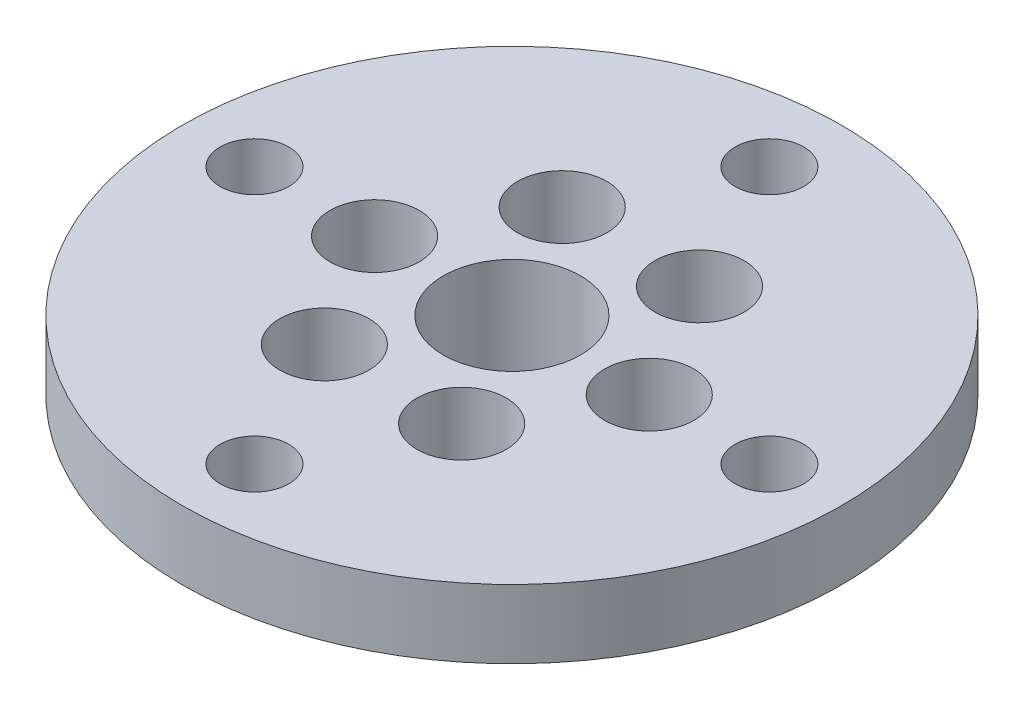
ISO-10303-21;
HEADER;
FILE_DESCRIPTION(('STEP AP214'),'2;1');
FILE_NAME('part.step','',(''),(''),'','','');
FILE_SCHEMA(('AUTOMOTIVE_DESIGN { 1 0 10303 214 1 1 1 1 }'));
ENDSEC;
DATA;
#1=APPLICATION_CONTEXT('core data for automotive mechanical design processes');
#2=APPLICATION_PROTOCOL_DEFINITION('international standard','automotive_design',2000,#1);
#3=PRODUCT_CONTEXT('',#1,'mechanical');
#4=PRODUCT('Part','Part','',(#3));
#5=PRODUCT_RELATED_PRODUCT_CATEGORY('part','',(#4));
#6=PRODUCT_DEFINITION_FORMATION('','',#4);
#7=PRODUCT_DEFINITION_CONTEXT('part definition',#1,'design');
#8=PRODUCT_DEFINITION('design','',#6,#7);
#9=PRODUCT_DEFINITION_SHAPE('','',#8);
#10=(LENGTH_UNIT() NAMED_UNIT(*) SI_UNIT(.MILLI.,.METRE.));
#11=(NAMED_UNIT(*) PLANE_ANGLE_UNIT() SI_UNIT($,.RADIAN.));
#12=(NAMED_UNIT(*) SI_UNIT($,.STERADIAN.) SOLID_ANGLE_UNIT());
#13=UNCERTAINTY_MEASURE_WITH_UNIT(LENGTH_MEASURE(1.E-05),#10,'distance_accuracy_value','');
#14=(GEOMETRIC_REPRESENTATION_CONTEXT(3) GLOBAL_UNCERTAINTY_ASSIGNED_CONTEXT((#13)) GLOBAL_UNIT_ASSIGNED_CONTEXT((#10,
#11,#12)) REPRESENTATION_CONTEXT('',''));
#15=CARTESIAN_POINT('',(0.,0.,0.));
#16=DIRECTION('',(0.,0.,1.));
#17=DIRECTION('',(1.,0.,0.));
#18=AXIS2_PLACEMENT_3D('',#15,#16,#17);
#19=CARTESIAN_POINT('',(-4.99999999999981,11.5,-8.66025403784503));
#20=DIRECTION('',(0.,-1.,0.));
#21=DIRECTION('',(0.,0.,-1.));
#22=AXIS2_PLACEMENT_3D('',#19,#20,#21);
#23=CYLINDRICAL_SURFACE('',#22,1.24999999999972);
#24=CARTESIAN_POINT('',(-4.99999999999981,0.,-8.66025403784503));
#25=DIRECTION('',(0.,1.,0.));
#26=DIRECTION('',(0.,0.,1.));
#27=AXIS2_PLACEMENT_3D('',#24,#25,#26);
#28=CIRCLE('',#27,1.24999999999972);
#29=CARTESIAN_POINT('',(-4.99999999999981,0.,-7.41025403784531));
#30=VERTEX_POINT('',#29);
#31=EDGE_CURVE('E65',#30,#30,#28,.T.);
#32=ORIENTED_EDGE('',*,*,#31,.F.);
#33=EDGE_LOOP('',(#32));
#34=FACE_BOUND('',#33,.T.);
#35=CARTESIAN_POINT('',(-4.99999999999981,4.,-8.66025403784503));
#36=DIRECTION('',(0.,1.,0.));
#37=DIRECTION('',(0.,0.,1.));
#38=AXIS2_PLACEMENT_3D('',#35,#36,#37);
#39=CIRCLE('',#38,1.24999999999972);
#40=CARTESIAN_POINT('',(-4.99999999999981,4.,-7.41025403784531));
#41=VERTEX_POINT('',#40);
#42=EDGE_CURVE('E82',#41,#41,#39,.T.);
#43=ORIENTED_EDGE('',*,*,#42,.T.);
#44=EDGE_LOOP('',(#43));
#45=FACE_BOUND('',#44,.T.);
#46=ADVANCED_FACE('F43',(#34,#45),#23,.F.);
#47=CARTESIAN_POINT('',(-9.99999999999999,11.5,-2.00360561475321E-13));
#48=DIRECTION('',(0.,-1.,0.));
#49=DIRECTION('',(0.,0.,-1.));
#50=AXIS2_PLACEMENT_3D('',#47,#48,#49);
#51=CYLINDRICAL_SURFACE('',#50,1.25);
#52=CARTESIAN_POINT('',(-9.99999999999999,0.,-2.00360561475321E-13));
#53=DIRECTION('',(0.,1.,0.));
#54=DIRECTION('',(0.,0.,1.));
#55=AXIS2_PLACEMENT_3D('',#52,#53,#54);
#56=CIRCLE('',#55,1.25);
#57=CARTESIAN_POINT('',(-9.99999999999999,0.,1.2499999999998));
#58=VERTEX_POINT('',#57);
#59=EDGE_CURVE('E85',#58,#58,#56,.T.);
#60=ORIENTED_EDGE('',*,*,#59,.F.);
#61=EDGE_LOOP('',(#60));
#62=FACE_BOUND('',#61,.T.);
#63=CARTESIAN_POINT('',(-9.99999999999999,4.,-2.00360561475321E-13));
#64=DIRECTION('',(0.,1.,0.));
#65=DIRECTION('',(0.,0.,1.));
#66=AXIS2_PLACEMENT_3D('',#63,#64,#65);
#67=CIRCLE('',#66,1.25);
#68=CARTESIAN_POINT('',(-9.99999999999999,4.,1.2499999999998));
#69=VERTEX_POINT('',#68);
#70=EDGE_CURVE('E79',#69,#69,#67,.T.);
#71=ORIENTED_EDGE('',*,*,#70,.T.);
#72=EDGE_LOOP('',(#71));
#73=FACE_BOUND('',#72,.T.);
#74=ADVANCED_FACE('F183',(#62,#73),#51,.F.);
#75=CARTESIAN_POINT('',(-4.99999999999968,11.5,8.66025403784456));
#76=DIRECTION('',(0.,-1.,0.));
#77=DIRECTION('',(0.,0.,-1.));
#78=AXIS2_PLACEMENT_3D('',#75,#76,#77);
#79=CYLINDRICAL_SURFACE('',#78,1.25000000000053);
#80=CARTESIAN_POINT('',(-4.99999999999968,0.,8.66025403784456));
#81=DIRECTION('',(0.,1.,0.));
#82=DIRECTION('',(0.,0.,1.));
#83=AXIS2_PLACEMENT_3D('',#80,#81,#82);
#84=CIRCLE('',#83,1.25000000000053);
#85=CARTESIAN_POINT('',(-4.99999999999968,0.,9.91025403784509));
#86=VERTEX_POINT('',#85);
#87=EDGE_CURVE('E140',#86,#86,#84,.T.);
#88=ORIENTED_EDGE('',*,*,#87,.F.);
#89=EDGE_LOOP('',(#88));
#90=FACE_BOUND('',#89,.T.);
#91=CARTESIAN_POINT('',(-4.99999999999968,4.,8.66025403784456));
#92=DIRECTION('',(0.,1.,0.));
#93=DIRECTION('',(0.,0.,1.));
#94=AXIS2_PLACEMENT_3D('',#91,#92,#93);
#95=CIRCLE('',#94,1.25000000000053);
#96=CARTESIAN_POINT('',(-4.99999999999968,4.,9.91025403784509));
#97=VERTEX_POINT('',#96);
#98=EDGE_CURVE('E76',#97,#97,#95,.T.);
#99=ORIENTED_EDGE('',*,*,#98,.T.);
#100=EDGE_LOOP('',(#99));
#101=FACE_BOUND('',#100,.T.);
#102=ADVANCED_FACE('F189',(#90,#101),#79,.F.);
#103=CARTESIAN_POINT('',(5.00000000000066,11.5,-8.6602540378451));
#104=DIRECTION('',(0.,-1.,0.));
#105=DIRECTION('',(0.,0.,-1.));
#106=AXIS2_PLACEMENT_3D('',#103,#104,#105);
#107=CYLINDRICAL_SURFACE('',#106,1.25000000000011);
#108=CARTESIAN_POINT('',(5.00000000000066,0.,-8.6602540378451));
#109=DIRECTION('',(0.,1.,0.));
#110=DIRECTION('',(0.,0.,1.));
#111=AXIS2_PLACEMENT_3D('',#108,#109,#110);
#112=CIRCLE('',#111,1.25000000000011);
#113=CARTESIAN_POINT('',(5.00000000000066,0.,-7.41025403784499));
#114=VERTEX_POINT('',#113);
#115=EDGE_CURVE('E149',#114,#114,#112,.T.);
#116=ORIENTED_EDGE('',*,*,#115,.F.);
#117=EDGE_LOOP('',(#116));
#118=FACE_BOUND('',#117,.T.);
#119=CARTESIAN_POINT('',(5.00000000000066,4.,-8.6602540378451));
#120=DIRECTION('',(0.,1.,0.));
#121=DIRECTION('',(0.,0.,1.));
#122=AXIS2_PLACEMENT_3D('',#119,#120,#121);
#123=CIRCLE('',#122,1.25000000000011);
#124=CARTESIAN_POINT('',(5.00000000000066,4.,-7.41025403784499));
#125=VERTEX_POINT('',#124);
#126=EDGE_CURVE('E73',#125,#125,#123,.T.);
#127=ORIENTED_EDGE('',*,*,#126,.T.);
#128=EDGE_LOOP('',(#127));
#129=FACE_BOUND('',#128,.T.);
#130=ADVANCED_FACE('F195',(#118,#129),#107,.F.);
#131=CARTESIAN_POINT('',(10.000000000001,11.5,-3.44968021723089E-13));
#132=DIRECTION('',(0.,-1.,0.));
#133=DIRECTION('',(0.,0.,-1.));
#134=AXIS2_PLACEMENT_3D('',#131,#132,#133);
#135=CYLINDRICAL_SURFACE('',#134,1.25000000000068);
#136=CARTESIAN_POINT('',(10.000000000001,0.,-3.44968021723089E-13));
#137=DIRECTION('',(0.,1.,0.));
#138=DIRECTION('',(0.,0.,1.));
#139=AXIS2_PLACEMENT_3D('',#136,#137,#138);
#140=CIRCLE('',#139,1.25000000000068);
#141=CARTESIAN_POINT('',(10.000000000001,0.,1.25000000000034));
#142=VERTEX_POINT('',#141);
#143=EDGE_CURVE('E146',#142,#142,#140,.T.);
#144=ORIENTED_EDGE('',*,*,#143,.F.);
#145=EDGE_LOOP('',(#144));
#146=FACE_BOUND('',#145,.T.);
#147=CARTESIAN_POINT('',(10.000000000001,4.,-3.44968021723089E-13));
#148=DIRECTION('',(0.,1.,0.));
#149=DIRECTION('',(0.,0.,1.));
#150=AXIS2_PLACEMENT_3D('',#147,#148,#149);
#151=CIRCLE('',#150,1.25000000000068);
#152=CARTESIAN_POINT('',(10.000000000001,4.,1.25000000000034));
#153=VERTEX_POINT('',#152);
#154=EDGE_CURVE('E69',#153,#153,#151,.T.);
#155=ORIENTED_EDGE('',*,*,#154,.T.);
#156=EDGE_LOOP('',(#155));
#157=FACE_BOUND('',#156,.T.);
#158=ADVANCED_FACE('F197',(#146,#157),#135,.F.);
#159=CARTESIAN_POINT('',(5.00000000000078,11.5,8.66025403784449));
#160=DIRECTION('',(0.,-1.,0.));
#161=DIRECTION('',(0.,0.,-1.));
#162=AXIS2_PLACEMENT_3D('',#159,#160,#161);
#163=CYLINDRICAL_SURFACE('',#162,1.25000000000087);
#164=CARTESIAN_POINT('',(5.00000000000078,0.,8.66025403784449));
#165=DIRECTION('',(0.,1.,0.));
#166=DIRECTION('',(0.,0.,1.));
#167=AXIS2_PLACEMENT_3D('',#164,#165,#166);
#168=CIRCLE('',#167,1.25000000000087);
#169=CARTESIAN_POINT('',(5.00000000000078,0.,9.91025403784536));
#170=VERTEX_POINT('',#169);
#171=EDGE_CURVE('E143',#170,#170,#168,.T.);
#172=ORIENTED_EDGE('',*,*,#171,.F.);
#173=EDGE_LOOP('',(#172));
#174=FACE_BOUND('',#173,.T.);
#175=CARTESIAN_POINT('',(5.00000000000078,4.,8.66025403784449));
#176=DIRECTION('',(0.,1.,0.));
#177=DIRECTION('',(0.,0.,1.));
#178=AXIS2_PLACEMENT_3D('',#175,#176,#177);
#179=CIRCLE('',#178,1.25000000000087);
#180=CARTESIAN_POINT('',(5.00000000000078,4.,9.91025403784536));
#181=VERTEX_POINT('',#180);
#182=EDGE_CURVE('E66',#181,#181,#179,.T.);
#183=ORIENTED_EDGE('',*,*,#182,.T.);
#184=EDGE_LOOP('',(#183));
#185=FACE_BOUND('',#184,.T.);
#186=ADVANCED_FACE('F200',(#174,#185),#163,.F.);
#187=CARTESIAN_POINT('',(0.,5.,0.));
#188=DIRECTION('',(0.,-1.,0.));
#189=DIRECTION('',(0.,0.,-1.));
#190=AXIS2_PLACEMENT_3D('',#187,#188,#189);
#191=CYLINDRICAL_SURFACE('',#190,15.);
#192=CARTESIAN_POINT('',(0.,5.,0.));
#193=DIRECTION('',(0.,1.,0.));
#194=DIRECTION('',(0.,0.,1.));
#195=AXIS2_PLACEMENT_3D('',#192,#193,#194);
#196=CIRCLE('',#195,15.);
#197=CARTESIAN_POINT('',(0.,5.,15.));
#198=VERTEX_POINT('',#197);
#199=EDGE_CURVE('E11',#198,#198,#196,.T.);
#200=ORIENTED_EDGE('',*,*,#199,.F.);
#201=EDGE_LOOP('',(#200));
#202=FACE_BOUND('',#201,.T.);
#203=CARTESIAN_POINT('',(0.,0.,0.));
#204=DIRECTION('',(0.,1.,0.));
#205=DIRECTION('',(0.,0.,1.));
#206=AXIS2_PLACEMENT_3D('',#203,#204,#205);
#207=CIRCLE('',#206,15.);
#208=CARTESIAN_POINT('',(0.,0.,15.));
#209=VERTEX_POINT('',#208);
#210=EDGE_CURVE('E51',#209,#209,#207,.T.);
#211=ORIENTED_EDGE('',*,*,#210,.T.);
#212=EDGE_LOOP('',(#211));
#213=FACE_BOUND('',#212,.T.);
#214=ADVANCED_FACE('F45',(#202,#213),#191,.T.);
#215=CARTESIAN_POINT('',(0.,0.,0.));
#216=DIRECTION('',(0.,1.,0.));
#217=DIRECTION('',(0.,0.,1.));
#218=AXIS2_PLACEMENT_3D('',#215,#216,#217);
#219=PLANE('',#218);
#220=ORIENTED_EDGE('',*,*,#171,.T.);
#221=EDGE_LOOP('',(#220));
#222=FACE_BOUND('',#221,.T.);
#223=ORIENTED_EDGE('',*,*,#143,.T.);
#224=EDGE_LOOP('',(#223));
#225=FACE_BOUND('',#224,.T.);
#226=ORIENTED_EDGE('',*,*,#115,.T.);
#227=EDGE_LOOP('',(#226));
#228=FACE_BOUND('',#227,.T.);
#229=CARTESIAN_POINT('',(0.,0.,0.));
#230=DIRECTION('',(0.,1.,0.));
#231=DIRECTION('',(0.,0.,1.));
#232=AXIS2_PLACEMENT_3D('',#229,#230,#231);
#233=CIRCLE('',#232,5.);
#234=CARTESIAN_POINT('',(0.,0.,5.));
#235=VERTEX_POINT('',#234);
#236=EDGE_CURVE('E152',#235,#235,#233,.T.);
#237=ORIENTED_EDGE('',*,*,#236,.T.);
#238=EDGE_LOOP('',(#237));
#239=FACE_BOUND('',#238,.T.);
#240=ORIENTED_EDGE('',*,*,#87,.T.);
#241=EDGE_LOOP('',(#240));
#242=FACE_BOUND('',#241,.T.);
#243=ORIENTED_EDGE('',*,*,#59,.T.);
#244=EDGE_LOOP('',(#243));
#245=FACE_BOUND('',#244,.T.);
#246=ORIENTED_EDGE('',*,*,#31,.T.);
#247=EDGE_LOOP('',(#246));
#248=FACE_BOUND('',#247,.T.);
#249=ORIENTED_EDGE('',*,*,#210,.F.);
#250=EDGE_LOOP('',(#249));
#251=FACE_BOUND('',#250,.T.);
#252=ADVANCED_FACE('F303',(#222,#225,#228,#239,#242,#245,#248,#251),#219,.F.);
#253=CARTESIAN_POINT('',(0.,10.,0.));
#254=DIRECTION('',(0.,-1.,0.));
#255=DIRECTION('',(0.,0.,-1.));
#256=AXIS2_PLACEMENT_3D('',#253,#254,#255);
#257=CYLINDRICAL_SURFACE('',#256,24.);
#258=CARTESIAN_POINT('',(0.,10.,0.));
#259=DIRECTION('',(0.,1.,0.));
#260=DIRECTION('',(0.,0.,1.));
#261=AXIS2_PLACEMENT_3D('',#258,#259,#260);
#262=CIRCLE('',#261,24.);
#263=CARTESIAN_POINT('',(0.,10.,24.));
#264=VERTEX_POINT('',#263);
#265=EDGE_CURVE('E56',#264,#264,#262,.T.);
#266=ORIENTED_EDGE('',*,*,#265,.F.);
#267=EDGE_LOOP('',(#266));
#268=FACE_BOUND('',#267,.T.);
#269=CARTESIAN_POINT('',(0.,5.,0.));
#270=DIRECTION('',(0.,1.,0.));
#271=DIRECTION('',(0.,0.,1.));
#272=AXIS2_PLACEMENT_3D('',#269,#270,#271);
#273=CIRCLE('',#272,24.);
#274=CARTESIAN_POINT('',(0.,5.,24.));
#275=VERTEX_POINT('',#274);
#276=EDGE_CURVE('E59',#275,#275,#273,.T.);
#277=ORIENTED_EDGE('',*,*,#276,.T.);
#278=EDGE_LOOP('',(#277));
#279=FACE_BOUND('',#278,.T.);
#280=ADVANCED_FACE('F164',(#268,#279),#257,.T.);
#281=CARTESIAN_POINT('',(0.,10.,0.));
#282=DIRECTION('',(0.,1.,0.));
#283=DIRECTION('',(0.,0.,1.));
#284=AXIS2_PLACEMENT_3D('',#281,#282,#283);
#285=PLANE('',#284);
#286=CARTESIAN_POINT('',(0.,10.,-18.75));
#287=DIRECTION('',(0.,1.,0.));
#288=DIRECTION('',(0.,0.,1.));
#289=AXIS2_PLACEMENT_3D('',#286,#287,#288);
#290=CIRCLE('',#289,2.5);
#291=CARTESIAN_POINT('',(0.,10.,-16.25));
#292=VERTEX_POINT('',#291);
#293=EDGE_CURVE('E90',#292,#292,#290,.T.);
#294=ORIENTED_EDGE('',*,*,#293,.F.);
#295=EDGE_LOOP('',(#294));
#296=FACE_BOUND('',#295,.T.);
#297=CARTESIAN_POINT('',(18.75,10.,0.));
#298=DIRECTION('',(0.,1.,0.));
#299=DIRECTION('',(0.,0.,1.));
#300=AXIS2_PLACEMENT_3D('',#297,#298,#299);
#301=CIRCLE('',#300,2.5);
#302=CARTESIAN_POINT('',(18.75,10.,2.5));
#303=VERTEX_POINT('',#302);
#304=EDGE_CURVE('E275',#303,#303,#301,.T.);
#305=ORIENTED_EDGE('',*,*,#304,.F.);
#306=EDGE_LOOP('',(#305));
#307=FACE_BOUND('',#306,.T.);
#308=CARTESIAN_POINT('',(0.,10.,18.75));
#309=DIRECTION('',(0.,1.,0.));
#310=DIRECTION('',(0.,0.,1.));
#311=AXIS2_PLACEMENT_3D('',#308,#309,#310);
#312=CIRCLE('',#311,2.5);
#313=CARTESIAN_POINT('',(0.,10.,21.25));
#314=VERTEX_POINT('',#313);
#315=EDGE_CURVE('E278',#314,#314,#312,.T.);
#316=ORIENTED_EDGE('',*,*,#315,.F.);
#317=EDGE_LOOP('',(#316));
#318=FACE_BOUND('',#317,.T.);
#319=CARTESIAN_POINT('',(-18.75,10.,0.));
#320=DIRECTION('',(0.,1.,0.));
#321=DIRECTION('',(0.,0.,1.));
#322=AXIS2_PLACEMENT_3D('',#319,#320,#321);
#323=CIRCLE('',#322,2.5);
#324=CARTESIAN_POINT('',(-18.75,10.,2.5));
#325=VERTEX_POINT('',#324);
#326=EDGE_CURVE('E109',#325,#325,#323,.T.);
#327=ORIENTED_EDGE('',*,*,#326,.F.);
#328=EDGE_LOOP('',(#327));
#329=FACE_BOUND('',#328,.T.);
#330=CARTESIAN_POINT('',(5.00000000000066,10.,-8.6602540378451));
#331=DIRECTION('',(0.,1.,0.));
#332=DIRECTION('',(0.,0.,1.));
#333=AXIS2_PLACEMENT_3D('',#330,#331,#332);
#334=CIRCLE('',#333,3.25000000000011);
#335=CARTESIAN_POINT('',(5.00000000000066,10.,-5.41025403784499));
#336=VERTEX_POINT('',#335);
#337=EDGE_CURVE('E115',#336,#336,#334,.T.);
#338=ORIENTED_EDGE('',*,*,#337,.F.);
#339=EDGE_LOOP('',(#338));
#340=FACE_BOUND('',#339,.T.);
#341=CARTESIAN_POINT('',(5.00000000000025,10.,8.66025403784534));
#342=DIRECTION('',(0.,1.,0.));
#343=DIRECTION('',(0.,0.,1.));
#344=AXIS2_PLACEMENT_3D('',#341,#342,#343);
#345=CIRCLE('',#344,3.25000000000011);
#346=CARTESIAN_POINT('',(5.00000000000025,10.,11.9102540378455));
#347=VERTEX_POINT('',#346);
#348=EDGE_CURVE('E116',#347,#347,#345,.T.);
#349=ORIENTED_EDGE('',*,*,#348,.F.);
#350=EDGE_LOOP('',(#349));
#351=FACE_BOUND('',#350,.T.);
#352=CARTESIAN_POINT('',(-5.00000000000072,10.,8.66025403784507));
#353=DIRECTION('',(0.,1.,0.));
#354=DIRECTION('',(0.,0.,1.));
#355=AXIS2_PLACEMENT_3D('',#352,#353,#354);
#356=CIRCLE('',#355,3.25000000000011);
#357=CARTESIAN_POINT('',(-5.00000000000072,10.,11.9102540378452));
#358=VERTEX_POINT('',#357);
#359=EDGE_CURVE('E123',#358,#358,#356,.T.);
#360=ORIENTED_EDGE('',*,*,#359,.F.);
#361=EDGE_LOOP('',(#360));
#362=FACE_BOUND('',#361,.T.);
#363=CARTESIAN_POINT('',(-10.0000000000009,10.,-3.03576608295941E-13));
#364=DIRECTION('',(0.,1.,0.));
#365=DIRECTION('',(0.,0.,1.));
#366=AXIS2_PLACEMENT_3D('',#363,#364,#365);
#367=CIRCLE('',#366,3.25000000000011);
#368=CARTESIAN_POINT('',(-10.0000000000009,10.,3.24999999999981));
#369=VERTEX_POINT('',#368);
#370=EDGE_CURVE('E129',#369,#369,#367,.T.);
#371=ORIENTED_EDGE('',*,*,#370,.F.);
#372=EDGE_LOOP('',(#371));
#373=FACE_BOUND('',#372,.T.);
#374=CARTESIAN_POINT('',(-5.00000000000019,10.,-8.66025403784537));
#375=DIRECTION('',(0.,1.,0.));
#376=DIRECTION('',(0.,0.,1.));
#377=AXIS2_PLACEMENT_3D('',#374,#375,#376);
#378=CIRCLE('',#377,3.25000000000011);
#379=CARTESIAN_POINT('',(-5.00000000000019,10.,-5.41025403784526));
#380=VERTEX_POINT('',#379);
#381=EDGE_CURVE('E101',#380,#380,#378,.T.);
#382=ORIENTED_EDGE('',*,*,#381,.F.);
#383=EDGE_LOOP('',(#382));
#384=FACE_BOUND('',#383,.T.);
#385=CARTESIAN_POINT('',(10.0000000000009,10.,2.34187669256869E-13));
#386=DIRECTION('',(0.,1.,0.));
#387=DIRECTION('',(0.,0.,1.));
#388=AXIS2_PLACEMENT_3D('',#385,#386,#387);
#389=CIRCLE('',#388,3.25000000000011);
#390=CARTESIAN_POINT('',(10.0000000000009,10.,3.25000000000035));
#391=VERTEX_POINT('',#390);
#392=EDGE_CURVE('E119',#391,#391,#389,.T.);
#393=ORIENTED_EDGE('',*,*,#392,.F.);
#394=EDGE_LOOP('',(#393));
#395=FACE_BOUND('',#394,.T.);
#396=CARTESIAN_POINT('',(0.,10.,0.));
#397=DIRECTION('',(0.,1.,0.));
#398=DIRECTION('',(0.,0.,1.));
#399=AXIS2_PLACEMENT_3D('',#396,#397,#398);
#400=CIRCLE('',#399,5.);
#401=CARTESIAN_POINT('',(0.,10.,5.));
#402=VERTEX_POINT('',#401);
#403=EDGE_CURVE('E62',#402,#402,#400,.F.);
#404=ORIENTED_EDGE('',*,*,#403,.T.);
#405=EDGE_LOOP('',(#404));
#406=FACE_BOUND('',#405,.T.);
#407=ORIENTED_EDGE('',*,*,#265,.T.);
#408=EDGE_LOOP('',(#407));
#409=FACE_BOUND('',#408,.T.);
#410=ADVANCED_FACE('F169',(#296,#307,#318,#329,#340,#351,#362,#373,#384,#395,#406,#409),#285,.T.);
#411=CARTESIAN_POINT('',(0.,5.,0.));
#412=DIRECTION('',(0.,1.,0.));
#413=DIRECTION('',(0.,0.,1.));
#414=AXIS2_PLACEMENT_3D('',#411,#412,#413);
#415=PLANE('',#414);
#416=CARTESIAN_POINT('',(0.,5.,-18.75));
#417=DIRECTION('',(0.,1.,0.));
#418=DIRECTION('',(0.,0.,1.));
#419=AXIS2_PLACEMENT_3D('',#416,#417,#418);
#420=CIRCLE('',#419,2.5);
#421=CARTESIAN_POINT('',(0.,5.,-16.25));
#422=VERTEX_POINT('',#421);
#423=EDGE_CURVE('E47',#422,#422,#420,.T.);
#424=ORIENTED_EDGE('',*,*,#423,.T.);
#425=EDGE_LOOP('',(#424));
#426=FACE_BOUND('',#425,.T.);
#427=CARTESIAN_POINT('',(18.75,5.,0.));
#428=DIRECTION('',(0.,1.,0.));
#429=DIRECTION('',(0.,0.,1.));
#430=AXIS2_PLACEMENT_3D('',#427,#428,#429);
#431=CIRCLE('',#430,2.5);
#432=CARTESIAN_POINT('',(18.75,5.,2.5));
#433=VERTEX_POINT('',#432);
#434=EDGE_CURVE('E92',#433,#433,#431,.T.);
#435=ORIENTED_EDGE('',*,*,#434,.T.);
#436=EDGE_LOOP('',(#435));
#437=FACE_BOUND('',#436,.T.);
#438=CARTESIAN_POINT('',(0.,5.,18.75));
#439=DIRECTION('',(0.,1.,0.));
#440=DIRECTION('',(0.,0.,1.));
#441=AXIS2_PLACEMENT_3D('',#438,#439,#440);
#442=CIRCLE('',#441,2.5);
#443=CARTESIAN_POINT('',(0.,5.,21.25));
#444=VERTEX_POINT('',#443);
#445=EDGE_CURVE('E89',#444,#444,#442,.T.);
#446=ORIENTED_EDGE('',*,*,#445,.T.);
#447=EDGE_LOOP('',(#446));
#448=FACE_BOUND('',#447,.T.);
#449=CARTESIAN_POINT('',(-18.75,5.,0.));
#450=DIRECTION('',(0.,1.,0.));
#451=DIRECTION('',(0.,0.,1.));
#452=AXIS2_PLACEMENT_3D('',#449,#450,#451);
#453=CIRCLE('',#452,2.5);
#454=CARTESIAN_POINT('',(-18.75,5.,2.5));
#455=VERTEX_POINT('',#454);
#456=EDGE_CURVE('E86',#455,#455,#453,.T.);
#457=ORIENTED_EDGE('',*,*,#456,.T.);
#458=EDGE_LOOP('',(#457));
#459=FACE_BOUND('',#458,.T.);
#460=ORIENTED_EDGE('',*,*,#199,.T.);
#461=EDGE_LOOP('',(#460));
#462=FACE_BOUND('',#461,.T.);
#463=ORIENTED_EDGE('',*,*,#276,.F.);
#464=EDGE_LOOP('',(#463));
#465=FACE_BOUND('',#464,.T.);
#466=ADVANCED_FACE('F166',(#426,#437,#448,#459,#462,#465),#415,.F.);
#467=CARTESIAN_POINT('',(0.,11.5,0.));
#468=DIRECTION('',(0.,-1.,0.));
#469=DIRECTION('',(0.,0.,-1.));
#470=AXIS2_PLACEMENT_3D('',#467,#468,#469);
#471=CYLINDRICAL_SURFACE('',#470,5.);
#472=ORIENTED_EDGE('',*,*,#403,.F.);
#473=EDGE_LOOP('',(#472));
#474=FACE_BOUND('',#473,.T.);
#475=ORIENTED_EDGE('',*,*,#236,.F.);
#476=EDGE_LOOP('',(#475));
#477=FACE_BOUND('',#476,.T.);
#478=ADVANCED_FACE('F168',(#474,#477),#471,.F.);
#479=CARTESIAN_POINT('',(5.00000000000025,-9.19238815542544,8.66025403784534));
#480=DIRECTION('',(0.,1.,0.));
#481=DIRECTION('',(0.,0.,1.));
#482=AXIS2_PLACEMENT_3D('',#479,#480,#481);
#483=CYLINDRICAL_SURFACE('',#482,3.25000000000011);
#484=CARTESIAN_POINT('',(5.00000000000025,4.,8.66025403784534));
#485=DIRECTION('',(0.,1.,0.));
#486=DIRECTION('',(0.,0.,1.));
#487=AXIS2_PLACEMENT_3D('',#484,#485,#486);
#488=CIRCLE('',#487,3.25000000000011);
#489=CARTESIAN_POINT('',(5.00000000000025,4.,11.9102540378455));
#490=VERTEX_POINT('',#489);
#491=EDGE_CURVE('E120',#490,#490,#488,.F.);
#492=ORIENTED_EDGE('',*,*,#491,.T.);
#493=EDGE_LOOP('',(#492));
#494=FACE_BOUND('',#493,.T.);
#495=ORIENTED_EDGE('',*,*,#348,.T.);
#496=EDGE_LOOP('',(#495));
#497=FACE_BOUND('',#496,.T.);
#498=ADVANCED_FACE('F176',(#494,#497),#483,.F.);
#499=CARTESIAN_POINT('',(0.,4.,0.));
#500=DIRECTION('',(0.,1.,0.));
#501=DIRECTION('',(0.,0.,1.));
#502=AXIS2_PLACEMENT_3D('',#499,#500,#501);
#503=PLANE('',#502);
#504=ORIENTED_EDGE('',*,*,#182,.F.);
#505=EDGE_LOOP('',(#504));
#506=FACE_BOUND('',#505,.T.);
#507=ORIENTED_EDGE('',*,*,#491,.F.);
#508=EDGE_LOOP('',(#507));
#509=FACE_BOUND('',#508,.T.);
#510=ADVANCED_FACE('F214',(#506,#509),#503,.T.);
#511=CARTESIAN_POINT('',(10.0000000000009,-9.19238815542544,2.34187669256869E-13));
#512=DIRECTION('',(0.,1.,0.));
#513=DIRECTION('',(0.,0.,1.));
#514=AXIS2_PLACEMENT_3D('',#511,#512,#513);
#515=CYLINDRICAL_SURFACE('',#514,3.25000000000011);
#516=CARTESIAN_POINT('',(10.0000000000009,4.,2.34187669256869E-13));
#517=DIRECTION('',(0.,1.,0.));
#518=DIRECTION('',(0.,0.,1.));
#519=AXIS2_PLACEMENT_3D('',#516,#517,#518);
#520=CIRCLE('',#519,3.25000000000011);
#521=CARTESIAN_POINT('',(10.0000000000009,4.,3.25000000000035));
#522=VERTEX_POINT('',#521);
#523=EDGE_CURVE('E70',#522,#522,#520,.F.);
#524=ORIENTED_EDGE('',*,*,#523,.T.);
#525=EDGE_LOOP('',(#524));
#526=FACE_BOUND('',#525,.T.);
#527=ORIENTED_EDGE('',*,*,#392,.T.);
#528=EDGE_LOOP('',(#527));
#529=FACE_BOUND('',#528,.T.);
#530=ADVANCED_FACE('F210',(#526,#529),#515,.F.);
#531=CARTESIAN_POINT('',(0.,4.,0.));
#532=DIRECTION('',(0.,1.,0.));
#533=DIRECTION('',(0.,0.,1.));
#534=AXIS2_PLACEMENT_3D('',#531,#532,#533);
#535=PLANE('',#534);
#536=ORIENTED_EDGE('',*,*,#154,.F.);
#537=EDGE_LOOP('',(#536));
#538=FACE_BOUND('',#537,.T.);
#539=ORIENTED_EDGE('',*,*,#523,.F.);
#540=EDGE_LOOP('',(#539));
#541=FACE_BOUND('',#540,.T.);
#542=ADVANCED_FACE('F213',(#538,#541),#535,.T.);
#543=CARTESIAN_POINT('',(5.00000000000066,-9.19238815542544,-8.6602540378451));
#544=DIRECTION('',(0.,1.,0.));
#545=DIRECTION('',(0.,0.,1.));
#546=AXIS2_PLACEMENT_3D('',#543,#544,#545);
#547=CYLINDRICAL_SURFACE('',#546,3.25000000000011);
#548=CARTESIAN_POINT('',(5.00000000000066,4.,-8.6602540378451));
#549=DIRECTION('',(0.,1.,0.));
#550=DIRECTION('',(0.,0.,1.));
#551=AXIS2_PLACEMENT_3D('',#548,#549,#550);
#552=CIRCLE('',#551,3.25000000000011);
#553=CARTESIAN_POINT('',(5.00000000000066,4.,-5.41025403784499));
#554=VERTEX_POINT('',#553);
#555=EDGE_CURVE('E112',#554,#554,#552,.F.);
#556=ORIENTED_EDGE('',*,*,#555,.T.);
#557=EDGE_LOOP('',(#556));
#558=FACE_BOUND('',#557,.T.);
#559=ORIENTED_EDGE('',*,*,#337,.T.);
#560=EDGE_LOOP('',(#559));
#561=FACE_BOUND('',#560,.T.);
#562=ADVANCED_FACE('F218',(#558,#561),#547,.F.);
#563=CARTESIAN_POINT('',(0.,4.,0.));
#564=DIRECTION('',(0.,1.,0.));
#565=DIRECTION('',(0.,0.,1.));
#566=AXIS2_PLACEMENT_3D('',#563,#564,#565);
#567=PLANE('',#566);
#568=ORIENTED_EDGE('',*,*,#126,.F.);
#569=EDGE_LOOP('',(#568));
#570=FACE_BOUND('',#569,.T.);
#571=ORIENTED_EDGE('',*,*,#555,.F.);
#572=EDGE_LOOP('',(#571));
#573=FACE_BOUND('',#572,.T.);
#574=ADVANCED_FACE('F236',(#570,#573),#567,.T.);
#575=CARTESIAN_POINT('',(-5.00000000000072,-9.19238815542544,8.66025403784507));
#576=DIRECTION('',(0.,1.,0.));
#577=DIRECTION('',(0.,0.,1.));
#578=AXIS2_PLACEMENT_3D('',#575,#576,#577);
#579=CYLINDRICAL_SURFACE('',#578,3.25000000000011);
#580=CARTESIAN_POINT('',(-5.00000000000072,4.,8.66025403784507));
#581=DIRECTION('',(0.,1.,0.));
#582=DIRECTION('',(0.,0.,1.));
#583=AXIS2_PLACEMENT_3D('',#580,#581,#582);
#584=CIRCLE('',#583,3.25000000000011);
#585=CARTESIAN_POINT('',(-5.00000000000072,4.,11.9102540378452));
#586=VERTEX_POINT('',#585);
#587=EDGE_CURVE('E126',#586,#586,#584,.F.);
#588=ORIENTED_EDGE('',*,*,#587,.T.);
#589=EDGE_LOOP('',(#588));
#590=FACE_BOUND('',#589,.T.);
#591=ORIENTED_EDGE('',*,*,#359,.T.);
#592=EDGE_LOOP('',(#591));
#593=FACE_BOUND('',#592,.T.);
#594=ADVANCED_FACE('F232',(#590,#593),#579,.F.);
#595=CARTESIAN_POINT('',(0.,4.,0.));
#596=DIRECTION('',(0.,1.,0.));
#597=DIRECTION('',(0.,0.,1.));
#598=AXIS2_PLACEMENT_3D('',#595,#596,#597);
#599=PLANE('',#598);
#600=ORIENTED_EDGE('',*,*,#98,.F.);
#601=EDGE_LOOP('',(#600));
#602=FACE_BOUND('',#601,.T.);
#603=ORIENTED_EDGE('',*,*,#587,.F.);
#604=EDGE_LOOP('',(#603));
#605=FACE_BOUND('',#604,.T.);
#606=ADVANCED_FACE('F228',(#602,#605),#599,.T.);
#607=CARTESIAN_POINT('',(-10.0000000000009,-9.19238815542544,-3.03576608295941E-13));
#608=DIRECTION('',(0.,1.,0.));
#609=DIRECTION('',(0.,0.,1.));
#610=AXIS2_PLACEMENT_3D('',#607,#608,#609);
#611=CYLINDRICAL_SURFACE('',#610,3.25000000000011);
#612=CARTESIAN_POINT('',(-10.0000000000009,4.,-3.03576608295941E-13));
#613=DIRECTION('',(0.,1.,0.));
#614=DIRECTION('',(0.,0.,1.));
#615=AXIS2_PLACEMENT_3D('',#612,#613,#614);
#616=CIRCLE('',#615,3.25000000000011);
#617=CARTESIAN_POINT('',(-10.0000000000009,4.,3.24999999999981));
#618=VERTEX_POINT('',#617);
#619=EDGE_CURVE('E106',#618,#618,#616,.F.);
#620=ORIENTED_EDGE('',*,*,#619,.T.);
#621=EDGE_LOOP('',(#620));
#622=FACE_BOUND('',#621,.T.);
#623=ORIENTED_EDGE('',*,*,#370,.T.);
#624=EDGE_LOOP('',(#623));
#625=FACE_BOUND('',#624,.T.);
#626=ADVANCED_FACE('F224',(#622,#625),#611,.F.);
#627=CARTESIAN_POINT('',(0.,4.,0.));
#628=DIRECTION('',(0.,1.,0.));
#629=DIRECTION('',(0.,0.,1.));
#630=AXIS2_PLACEMENT_3D('',#627,#628,#629);
#631=PLANE('',#630);
#632=ORIENTED_EDGE('',*,*,#70,.F.);
#633=EDGE_LOOP('',(#632));
#634=FACE_BOUND('',#633,.T.);
#635=ORIENTED_EDGE('',*,*,#619,.F.);
#636=EDGE_LOOP('',(#635));
#637=FACE_BOUND('',#636,.T.);
#638=ADVANCED_FACE('F220',(#634,#637),#631,.T.);
#639=CARTESIAN_POINT('',(-5.00000000000019,-9.19238815542544,-8.66025403784537));
#640=DIRECTION('',(0.,1.,0.));
#641=DIRECTION('',(0.,0.,1.));
#642=AXIS2_PLACEMENT_3D('',#639,#640,#641);
#643=CYLINDRICAL_SURFACE('',#642,3.25000000000011);
#644=CARTESIAN_POINT('',(-5.00000000000019,4.,-8.66025403784537));
#645=DIRECTION('',(0.,1.,0.));
#646=DIRECTION('',(0.,0.,1.));
#647=AXIS2_PLACEMENT_3D('',#644,#645,#646);
#648=CIRCLE('',#647,3.25000000000011);
#649=CARTESIAN_POINT('',(-5.00000000000019,4.,-5.41025403784526));
#650=VERTEX_POINT('',#649);
#651=EDGE_CURVE('E97',#650,#650,#648,.F.);
#652=ORIENTED_EDGE('',*,*,#651,.T.);
#653=EDGE_LOOP('',(#652));
#654=FACE_BOUND('',#653,.T.);
#655=ORIENTED_EDGE('',*,*,#381,.T.);
#656=EDGE_LOOP('',(#655));
#657=FACE_BOUND('',#656,.T.);
#658=ADVANCED_FACE('F223',(#654,#657),#643,.F.);
#659=CARTESIAN_POINT('',(0.,4.,0.));
#660=DIRECTION('',(0.,1.,0.));
#661=DIRECTION('',(0.,0.,1.));
#662=AXIS2_PLACEMENT_3D('',#659,#660,#661);
#663=PLANE('',#662);
#664=ORIENTED_EDGE('',*,*,#42,.F.);
#665=EDGE_LOOP('',(#664));
#666=FACE_BOUND('',#665,.T.);
#667=ORIENTED_EDGE('',*,*,#651,.F.);
#668=EDGE_LOOP('',(#667));
#669=FACE_BOUND('',#668,.T.);
#670=ADVANCED_FACE('F250',(#666,#669),#663,.T.);
#671=CARTESIAN_POINT('',(-18.75,-7.07106781186548,0.));
#672=DIRECTION('',(0.,1.,0.));
#673=DIRECTION('',(0.,0.,1.));
#674=AXIS2_PLACEMENT_3D('',#671,#672,#673);
#675=CYLINDRICAL_SURFACE('',#674,2.5);
#676=ORIENTED_EDGE('',*,*,#326,.T.);
#677=EDGE_LOOP('',(#676));
#678=FACE_BOUND('',#677,.T.);
#679=ORIENTED_EDGE('',*,*,#456,.F.);
#680=EDGE_LOOP('',(#679));
#681=FACE_BOUND('',#680,.T.);
#682=ADVANCED_FACE('F253',(#678,#681),#675,.F.);
#683=CARTESIAN_POINT('',(0.,-7.07106781186548,18.75));
#684=DIRECTION('',(0.,1.,0.));
#685=DIRECTION('',(0.,0.,1.));
#686=AXIS2_PLACEMENT_3D('',#683,#684,#685);
#687=CYLINDRICAL_SURFACE('',#686,2.5);
#688=ORIENTED_EDGE('',*,*,#315,.T.);
#689=EDGE_LOOP('',(#688));
#690=FACE_BOUND('',#689,.T.);
#691=ORIENTED_EDGE('',*,*,#445,.F.);
#692=EDGE_LOOP('',(#691));
#693=FACE_BOUND('',#692,.T.);
#694=ADVANCED_FACE('F258',(#690,#693),#687,.F.);
#695=CARTESIAN_POINT('',(18.75,-7.07106781186548,0.));
#696=DIRECTION('',(0.,1.,0.));
#697=DIRECTION('',(0.,0.,1.));
#698=AXIS2_PLACEMENT_3D('',#695,#696,#697);
#699=CYLINDRICAL_SURFACE('',#698,2.5);
#700=ORIENTED_EDGE('',*,*,#304,.T.);
#701=EDGE_LOOP('',(#700));
#702=FACE_BOUND('',#701,.T.);
#703=ORIENTED_EDGE('',*,*,#434,.F.);
#704=EDGE_LOOP('',(#703));
#705=FACE_BOUND('',#704,.T.);
#706=ADVANCED_FACE('F262',(#702,#705),#699,.F.);
#707=CARTESIAN_POINT('',(0.,-7.07106781186548,-18.75));
#708=DIRECTION('',(0.,1.,0.));
#709=DIRECTION('',(0.,0.,1.));
#710=AXIS2_PLACEMENT_3D('',#707,#708,#709);
#711=CYLINDRICAL_SURFACE('',#710,2.5);
#712=ORIENTED_EDGE('',*,*,#293,.T.);
#713=EDGE_LOOP('',(#712));
#714=FACE_BOUND('',#713,.T.);
#715=ORIENTED_EDGE('',*,*,#423,.F.);
#716=EDGE_LOOP('',(#715));
#717=FACE_BOUND('',#716,.T.);
#718=ADVANCED_FACE('F266',(#714,#717),#711,.F.);
#719=CLOSED_SHELL('',(#46,#74,#102,#130,#158,#186,#214,#252,#280,#410,#466,#478,#498,#510,#530,
#542,#562,#574,#594,#606,#626,#638,#658,#670,#682,#694,#706,#718));
#720=MANIFOLD_SOLID_BREP('B2',#719);
#721=ADVANCED_BREP_SHAPE_REPRESENTATION('',(#18,#720),#14);
#722=SHAPE_DEFINITION_REPRESENTATION(#9,#721);
ENDSEC;
END-ISO-10303-21;
